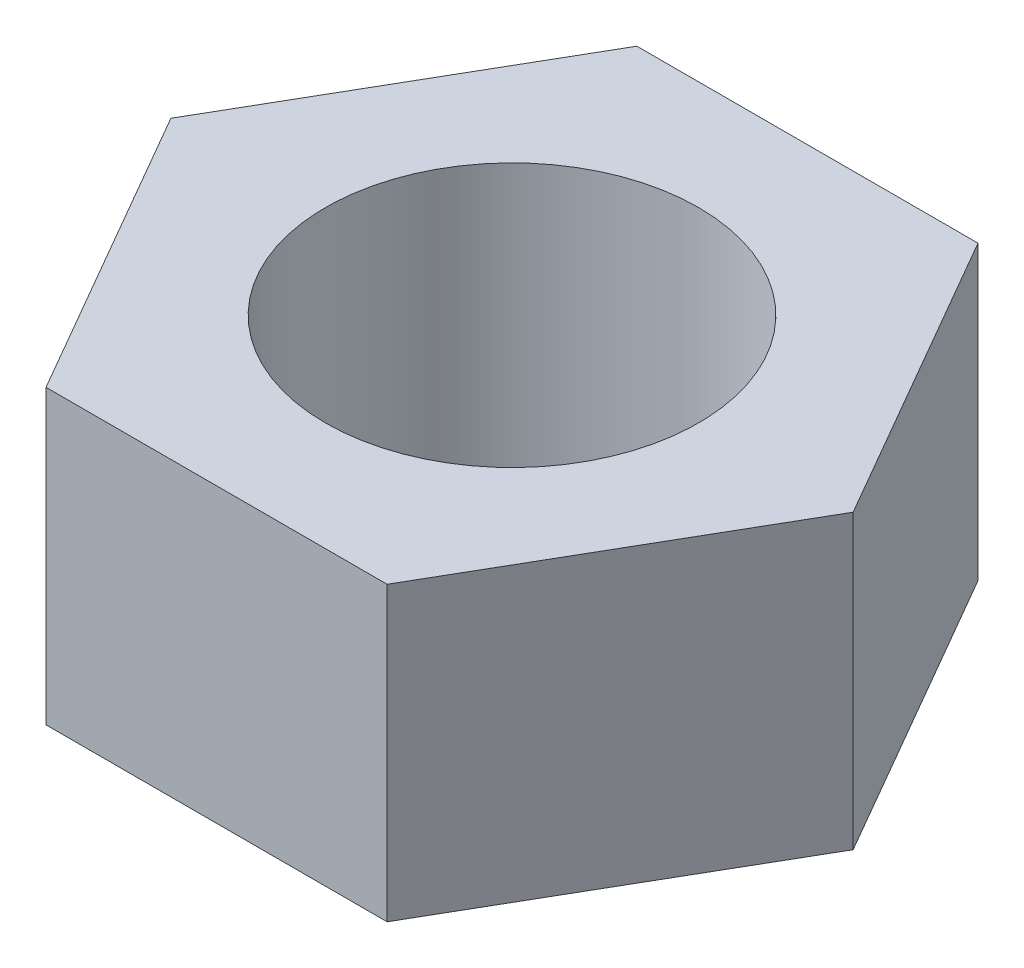
ISO-10303-21;
HEADER;
FILE_DESCRIPTION(('STEP AP214'),'2;1');
FILE_NAME('part.step','',(''),(''),'','','');
FILE_SCHEMA(('AUTOMOTIVE_DESIGN { 1 0 10303 214 1 1 1 1 }'));
ENDSEC;
DATA;
#1=APPLICATION_CONTEXT('core data for automotive mechanical design processes');
#2=APPLICATION_PROTOCOL_DEFINITION('international standard','automotive_design',2000,#1);
#3=PRODUCT_CONTEXT('',#1,'mechanical');
#4=PRODUCT('Part','Part','',(#3));
#5=PRODUCT_RELATED_PRODUCT_CATEGORY('part','',(#4));
#6=PRODUCT_DEFINITION_FORMATION('','',#4);
#7=PRODUCT_DEFINITION_CONTEXT('part definition',#1,'design');
#8=PRODUCT_DEFINITION('design','',#6,#7);
#9=PRODUCT_DEFINITION_SHAPE('','',#8);
#10=(LENGTH_UNIT() NAMED_UNIT(*) SI_UNIT(.MILLI.,.METRE.));
#11=(NAMED_UNIT(*) PLANE_ANGLE_UNIT() SI_UNIT($,.RADIAN.));
#12=(NAMED_UNIT(*) SI_UNIT($,.STERADIAN.) SOLID_ANGLE_UNIT());
#13=UNCERTAINTY_MEASURE_WITH_UNIT(LENGTH_MEASURE(1.E-05),#10,'distance_accuracy_value','');
#14=(GEOMETRIC_REPRESENTATION_CONTEXT(3) GLOBAL_UNCERTAINTY_ASSIGNED_CONTEXT((#13)) GLOBAL_UNIT_ASSIGNED_CONTEXT((#10,
#11,#12)) REPRESENTATION_CONTEXT('',''));
#15=CARTESIAN_POINT('',(0.,0.,0.));
#16=DIRECTION('',(0.,0.,1.));
#17=DIRECTION('',(1.,0.,0.));
#18=AXIS2_PLACEMENT_3D('',#15,#16,#17);
#19=CARTESIAN_POINT('',(0.,9.4,0.));
#20=DIRECTION('',(0.,-1.,0.));
#21=DIRECTION('',(0.,0.,-1.));
#22=AXIS2_PLACEMENT_3D('',#19,#20,#21);
#23=CYLINDRICAL_SURFACE('',#22,6.);
#24=CARTESIAN_POINT('',(0.,0.,0.));
#25=DIRECTION('',(0.,1.,0.));
#26=DIRECTION('',(0.,0.,1.));
#27=AXIS2_PLACEMENT_3D('',#24,#25,#26);
#28=CIRCLE('',#27,6.);
#29=CARTESIAN_POINT('',(0.,0.,6.));
#30=VERTEX_POINT('',#29);
#31=EDGE_CURVE('E224',#30,#30,#28,.T.);
#32=ORIENTED_EDGE('',*,*,#31,.F.);
#33=EDGE_LOOP('',(#32));
#34=FACE_BOUND('',#33,.T.);
#35=CARTESIAN_POINT('',(0.,9.4,0.));
#36=DIRECTION('',(0.,1.,0.));
#37=DIRECTION('',(0.,0.,1.));
#38=AXIS2_PLACEMENT_3D('',#35,#36,#37);
#39=CIRCLE('',#38,6.);
#40=CARTESIAN_POINT('',(0.,9.4,6.));
#41=VERTEX_POINT('',#40);
#42=EDGE_CURVE('E237',#41,#41,#39,.T.);
#43=ORIENTED_EDGE('',*,*,#42,.T.);
#44=EDGE_LOOP('',(#43));
#45=FACE_BOUND('',#44,.T.);
#46=ADVANCED_FACE('F119',(#34,#45),#23,.F.);
#47=CARTESIAN_POINT('',(0.,0.,0.));
#48=DIRECTION('',(0.,1.,0.));
#49=DIRECTION('',(0.,0.,1.));
#50=AXIS2_PLACEMENT_3D('',#47,#48,#49);
#51=PLANE('',#50);
#52=ORIENTED_EDGE('',*,*,#31,.T.);
#53=EDGE_LOOP('',(#52));
#54=FACE_BOUND('',#53,.T.);
#55=DIRECTION('',(0.5,0.,-0.866025403784439));
#56=VECTOR('',#55,1.);
#57=CARTESIAN_POINT('',(8.22724133595217,0.,4.75));
#58=LINE('',#57,#56);
#59=CARTESIAN_POINT('',(5.48482755730145,0.,9.50000000000001));
#60=VERTEX_POINT('',#59);
#61=CARTESIAN_POINT('',(10.9696551146029,0.,0.));
#62=VERTEX_POINT('',#61);
#63=EDGE_CURVE('E228',#60,#62,#58,.T.);
#64=ORIENTED_EDGE('',*,*,#63,.F.);
#65=DIRECTION('',(1.,0.,0.));
#66=VECTOR('',#65,1.);
#67=CARTESIAN_POINT('',(0.,0.,9.50000000000001));
#68=LINE('',#67,#66);
#69=CARTESIAN_POINT('',(-5.48482755730145,0.,9.50000000000001));
#70=VERTEX_POINT('',#69);
#71=EDGE_CURVE('E218',#70,#60,#68,.T.);
#72=ORIENTED_EDGE('',*,*,#71,.F.);
#73=DIRECTION('',(0.5,0.,0.866025403784439));
#74=VECTOR('',#73,1.);
#75=CARTESIAN_POINT('',(-8.22724133595217,0.,4.75));
#76=LINE('',#75,#74);
#77=CARTESIAN_POINT('',(-10.9696551146029,0.,0.));
#78=VERTEX_POINT('',#77);
#79=EDGE_CURVE('E193',#78,#70,#76,.T.);
#80=ORIENTED_EDGE('',*,*,#79,.F.);
#81=DIRECTION('',(-0.5,0.,0.866025403784439));
#82=VECTOR('',#81,1.);
#83=CARTESIAN_POINT('',(-5.48482755730145,0.,-9.50000000000001));
#84=LINE('',#83,#82);
#85=CARTESIAN_POINT('',(-5.48482755730145,0.,-9.50000000000001));
#86=VERTEX_POINT('',#85);
#87=EDGE_CURVE('E179',#86,#78,#84,.T.);
#88=ORIENTED_EDGE('',*,*,#87,.F.);
#89=DIRECTION('',(-1.,0.,0.));
#90=VECTOR('',#89,1.);
#91=CARTESIAN_POINT('',(5.48482755730145,0.,-9.50000000000001));
#92=LINE('',#91,#90);
#93=CARTESIAN_POINT('',(5.48482755730145,0.,-9.50000000000001));
#94=VERTEX_POINT('',#93);
#95=EDGE_CURVE('E168',#94,#86,#92,.T.);
#96=ORIENTED_EDGE('',*,*,#95,.F.);
#97=DIRECTION('',(-0.5,0.,-0.866025403784438));
#98=VECTOR('',#97,1.);
#99=CARTESIAN_POINT('',(10.9696551146029,0.,0.));
#100=LINE('',#99,#98);
#101=EDGE_CURVE('E180',#62,#94,#100,.T.);
#102=ORIENTED_EDGE('',*,*,#101,.F.);
#103=EDGE_LOOP('',(#64,#72,#80,#88,#96,#102));
#104=FACE_BOUND('',#103,.T.);
#105=ADVANCED_FACE('F191',(#54,#104),#51,.F.);
#106=CARTESIAN_POINT('',(8.22724133595217,9.4,4.75));
#107=DIRECTION('',(-0.866025403784439,0.,-0.5));
#108=DIRECTION('',(-0.5,0.,0.866025403784439));
#109=AXIS2_PLACEMENT_3D('',#106,#107,#108);
#110=PLANE('',#109);
#111=ORIENTED_EDGE('',*,*,#63,.T.);
#112=DIRECTION('',(0.,-1.,0.));
#113=VECTOR('',#112,1.);
#114=CARTESIAN_POINT('',(10.9696551146029,9.4,0.));
#115=LINE('',#114,#113);
#116=CARTESIAN_POINT('',(10.9696551146029,9.4,0.));
#117=VERTEX_POINT('',#116);
#118=EDGE_CURVE('E12',#117,#62,#115,.T.);
#119=ORIENTED_EDGE('',*,*,#118,.F.);
#120=DIRECTION('',(0.5,0.,-0.866025403784439));
#121=VECTOR('',#120,1.);
#122=CARTESIAN_POINT('',(8.22724133595217,9.4,4.75));
#123=LINE('',#122,#121);
#124=CARTESIAN_POINT('',(5.48482755730145,9.4,9.50000000000001));
#125=VERTEX_POINT('',#124);
#126=EDGE_CURVE('E221',#125,#117,#123,.T.);
#127=ORIENTED_EDGE('',*,*,#126,.F.);
#128=DIRECTION('',(0.,-1.,0.));
#129=VECTOR('',#128,1.);
#130=CARTESIAN_POINT('',(5.48482755730145,9.4,9.50000000000001));
#131=LINE('',#130,#129);
#132=EDGE_CURVE('E214',#125,#60,#131,.T.);
#133=ORIENTED_EDGE('',*,*,#132,.T.);
#134=EDGE_LOOP('',(#111,#119,#127,#133));
#135=FACE_BOUND('',#134,.T.);
#136=ADVANCED_FACE('F248',(#135),#110,.F.);
#137=CARTESIAN_POINT('',(0.,9.4,9.50000000000001));
#138=DIRECTION('',(0.,0.,-1.));
#139=DIRECTION('',(-1.,0.,0.));
#140=AXIS2_PLACEMENT_3D('',#137,#138,#139);
#141=PLANE('',#140);
#142=ORIENTED_EDGE('',*,*,#71,.T.);
#143=ORIENTED_EDGE('',*,*,#132,.F.);
#144=DIRECTION('',(1.,0.,0.));
#145=VECTOR('',#144,1.);
#146=CARTESIAN_POINT('',(0.,9.4,9.50000000000001));
#147=LINE('',#146,#145);
#148=CARTESIAN_POINT('',(-5.48482755730145,9.4,9.50000000000001));
#149=VERTEX_POINT('',#148);
#150=EDGE_CURVE('E139',#149,#125,#147,.T.);
#151=ORIENTED_EDGE('',*,*,#150,.F.);
#152=DIRECTION('',(0.,-1.,0.));
#153=VECTOR('',#152,1.);
#154=CARTESIAN_POINT('',(-5.48482755730145,9.4,9.50000000000001));
#155=LINE('',#154,#153);
#156=EDGE_CURVE('E210',#149,#70,#155,.T.);
#157=ORIENTED_EDGE('',*,*,#156,.T.);
#158=EDGE_LOOP('',(#142,#143,#151,#157));
#159=FACE_BOUND('',#158,.T.);
#160=ADVANCED_FACE('F252',(#159),#141,.F.);
#161=CARTESIAN_POINT('',(-8.22724133595217,9.4,4.75));
#162=DIRECTION('',(0.866025403784439,0.,-0.5));
#163=DIRECTION('',(-0.5,0.,-0.866025403784439));
#164=AXIS2_PLACEMENT_3D('',#161,#162,#163);
#165=PLANE('',#164);
#166=ORIENTED_EDGE('',*,*,#79,.T.);
#167=ORIENTED_EDGE('',*,*,#156,.F.);
#168=DIRECTION('',(0.5,0.,0.866025403784439));
#169=VECTOR('',#168,1.);
#170=CARTESIAN_POINT('',(-8.22724133595217,9.4,4.75));
#171=LINE('',#170,#169);
#172=CARTESIAN_POINT('',(-10.9696551146029,9.4,0.));
#173=VERTEX_POINT('',#172);
#174=EDGE_CURVE('E234',#173,#149,#171,.T.);
#175=ORIENTED_EDGE('',*,*,#174,.F.);
#176=DIRECTION('',(0.,-1.,0.));
#177=VECTOR('',#176,1.);
#178=CARTESIAN_POINT('',(-10.9696551146029,9.4,0.));
#179=LINE('',#178,#177);
#180=EDGE_CURVE('E130',#173,#78,#179,.T.);
#181=ORIENTED_EDGE('',*,*,#180,.T.);
#182=EDGE_LOOP('',(#166,#167,#175,#181));
#183=FACE_BOUND('',#182,.T.);
#184=ADVANCED_FACE('F256',(#183),#165,.F.);
#185=CARTESIAN_POINT('',(0.,9.4,0.));
#186=DIRECTION('',(0.,1.,0.));
#187=DIRECTION('',(0.,0.,1.));
#188=AXIS2_PLACEMENT_3D('',#185,#186,#187);
#189=PLANE('',#188);
#190=ORIENTED_EDGE('',*,*,#42,.F.);
#191=EDGE_LOOP('',(#190));
#192=FACE_BOUND('',#191,.T.);
#193=ORIENTED_EDGE('',*,*,#126,.T.);
#194=DIRECTION('',(-0.5,0.,-0.866025403784438));
#195=VECTOR('',#194,1.);
#196=CARTESIAN_POINT('',(10.9696551146029,9.4,0.));
#197=LINE('',#196,#195);
#198=CARTESIAN_POINT('',(5.48482755730145,9.4,-9.50000000000001));
#199=VERTEX_POINT('',#198);
#200=EDGE_CURVE('E195',#117,#199,#197,.T.);
#201=ORIENTED_EDGE('',*,*,#200,.T.);
#202=DIRECTION('',(-1.,0.,0.));
#203=VECTOR('',#202,1.);
#204=CARTESIAN_POINT('',(5.48482755730145,9.4,-9.50000000000001));
#205=LINE('',#204,#203);
#206=CARTESIAN_POINT('',(-5.48482755730145,9.4,-9.50000000000001));
#207=VERTEX_POINT('',#206);
#208=EDGE_CURVE('E199',#199,#207,#205,.T.);
#209=ORIENTED_EDGE('',*,*,#208,.T.);
#210=DIRECTION('',(-0.5,0.,0.866025403784439));
#211=VECTOR('',#210,1.);
#212=CARTESIAN_POINT('',(-5.48482755730145,9.4,-9.50000000000001));
#213=LINE('',#212,#211);
#214=EDGE_CURVE('E188',#207,#173,#213,.T.);
#215=ORIENTED_EDGE('',*,*,#214,.T.);
#216=ORIENTED_EDGE('',*,*,#174,.T.);
#217=ORIENTED_EDGE('',*,*,#150,.T.);
#218=EDGE_LOOP('',(#193,#201,#209,#215,#216,#217));
#219=FACE_BOUND('',#218,.T.);
#220=ADVANCED_FACE('F243',(#192,#219),#189,.T.);
#221=CARTESIAN_POINT('',(10.9696551146029,9.4,0.));
#222=DIRECTION('',(-0.866025403784438,0.,0.5));
#223=DIRECTION('',(0.5,0.,0.866025403784438));
#224=AXIS2_PLACEMENT_3D('',#221,#222,#223);
#225=PLANE('',#224);
#226=ORIENTED_EDGE('',*,*,#101,.T.);
#227=DIRECTION('',(0.,-1.,0.));
#228=VECTOR('',#227,1.);
#229=CARTESIAN_POINT('',(5.48482755730145,9.4,-9.50000000000001));
#230=LINE('',#229,#228);
#231=EDGE_CURVE('E123',#199,#94,#230,.T.);
#232=ORIENTED_EDGE('',*,*,#231,.F.);
#233=ORIENTED_EDGE('',*,*,#200,.F.);
#234=ORIENTED_EDGE('',*,*,#118,.T.);
#235=EDGE_LOOP('',(#226,#232,#233,#234));
#236=FACE_BOUND('',#235,.T.);
#237=ADVANCED_FACE('F121',(#236),#225,.F.);
#238=CARTESIAN_POINT('',(5.48482755730145,9.4,-9.50000000000001));
#239=DIRECTION('',(0.,0.,1.));
#240=DIRECTION('',(1.,0.,0.));
#241=AXIS2_PLACEMENT_3D('',#238,#239,#240);
#242=PLANE('',#241);
#243=ORIENTED_EDGE('',*,*,#95,.T.);
#244=DIRECTION('',(0.,-1.,0.));
#245=VECTOR('',#244,1.);
#246=CARTESIAN_POINT('',(-5.48482755730145,9.4,-9.50000000000001));
#247=LINE('',#246,#245);
#248=EDGE_CURVE('E174',#207,#86,#247,.T.);
#249=ORIENTED_EDGE('',*,*,#248,.F.);
#250=ORIENTED_EDGE('',*,*,#208,.F.);
#251=ORIENTED_EDGE('',*,*,#231,.T.);
#252=EDGE_LOOP('',(#243,#249,#250,#251));
#253=FACE_BOUND('',#252,.T.);
#254=ADVANCED_FACE('F173',(#253),#242,.F.);
#255=CARTESIAN_POINT('',(-5.48482755730145,9.4,-9.50000000000001));
#256=DIRECTION('',(0.866025403784439,0.,0.5));
#257=DIRECTION('',(0.5,0.,-0.866025403784439));
#258=AXIS2_PLACEMENT_3D('',#255,#256,#257);
#259=PLANE('',#258);
#260=ORIENTED_EDGE('',*,*,#87,.T.);
#261=ORIENTED_EDGE('',*,*,#180,.F.);
#262=ORIENTED_EDGE('',*,*,#214,.F.);
#263=ORIENTED_EDGE('',*,*,#248,.T.);
#264=EDGE_LOOP('',(#260,#261,#262,#263));
#265=FACE_BOUND('',#264,.T.);
#266=ADVANCED_FACE('F184',(#265),#259,.F.);
#267=CLOSED_SHELL('',(#46,#105,#136,#160,#184,#220,#237,#254,#266));
#268=MANIFOLD_SOLID_BREP('B2',#267);
#269=ADVANCED_BREP_SHAPE_REPRESENTATION('',(#18,#268),#14);
#270=SHAPE_DEFINITION_REPRESENTATION(#9,#269);
ENDSEC;
END-ISO-10303-21;
